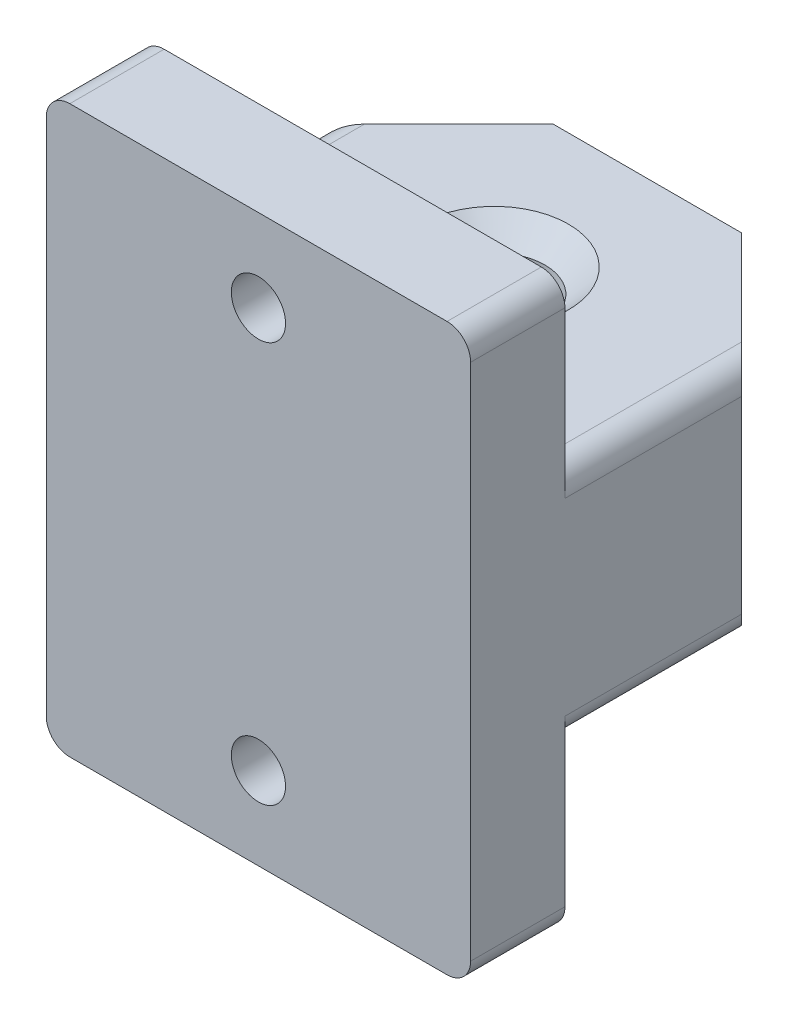
ISO-10303-21;
HEADER;
FILE_DESCRIPTION(('STEP AP214'),'2;1');
FILE_NAME('part.step','',(''),(''),'','','');
FILE_SCHEMA(('AUTOMOTIVE_DESIGN { 1 0 10303 214 1 1 1 1 }'));
ENDSEC;
DATA;
#1=APPLICATION_CONTEXT('core data for automotive mechanical design processes');
#2=APPLICATION_PROTOCOL_DEFINITION('international standard','automotive_design',2000,#1);
#3=PRODUCT_CONTEXT('',#1,'mechanical');
#4=PRODUCT('Part','Part','',(#3));
#5=PRODUCT_RELATED_PRODUCT_CATEGORY('part','',(#4));
#6=PRODUCT_DEFINITION_FORMATION('','',#4);
#7=PRODUCT_DEFINITION_CONTEXT('part definition',#1,'design');
#8=PRODUCT_DEFINITION('design','',#6,#7);
#9=PRODUCT_DEFINITION_SHAPE('','',#8);
#10=(LENGTH_UNIT() NAMED_UNIT(*) SI_UNIT(.MILLI.,.METRE.));
#11=(NAMED_UNIT(*) PLANE_ANGLE_UNIT() SI_UNIT($,.RADIAN.));
#12=(NAMED_UNIT(*) SI_UNIT($,.STERADIAN.) SOLID_ANGLE_UNIT());
#13=UNCERTAINTY_MEASURE_WITH_UNIT(LENGTH_MEASURE(1.E-05),#10,'distance_accuracy_value','');
#14=(GEOMETRIC_REPRESENTATION_CONTEXT(3) GLOBAL_UNCERTAINTY_ASSIGNED_CONTEXT((#13)) GLOBAL_UNIT_ASSIGNED_CONTEXT((#10,
#11,#12)) REPRESENTATION_CONTEXT('',''));
#15=CARTESIAN_POINT('',(0.,0.,0.));
#16=DIRECTION('',(0.,0.,1.));
#17=DIRECTION('',(1.,0.,0.));
#18=AXIS2_PLACEMENT_3D('',#15,#16,#17);
#19=CARTESIAN_POINT('',(9.,-5.,23.));
#20=DIRECTION('',(-1.,0.,0.));
#21=DIRECTION('',(0.,0.,1.));
#22=AXIS2_PLACEMENT_3D('',#19,#20,#21);
#23=PLANE('',#22);
#24=DIRECTION('',(0.,0.,-1.));
#25=VECTOR('',#24,1.);
#26=CARTESIAN_POINT('',(9.,-4.,23.));
#27=LINE('',#26,#25);
#28=CARTESIAN_POINT('',(9.,-4.,19.));
#29=VERTEX_POINT('',#28);
#30=CARTESIAN_POINT('',(9.,-4.,11.5));
#31=VERTEX_POINT('',#30);
#32=EDGE_CURVE('E192',#29,#31,#27,.T.);
#33=ORIENTED_EDGE('',*,*,#32,.T.);
#34=DIRECTION('',(0.,1.,0.));
#35=VECTOR('',#34,1.);
#36=CARTESIAN_POINT('',(9.,-5.,11.5));
#37=LINE('',#36,#35);
#38=CARTESIAN_POINT('',(9.,4.,11.5));
#39=VERTEX_POINT('',#38);
#40=EDGE_CURVE('E452',#31,#39,#37,.T.);
#41=ORIENTED_EDGE('',*,*,#40,.T.);
#42=DIRECTION('',(0.,0.,-1.));
#43=VECTOR('',#42,1.);
#44=CARTESIAN_POINT('',(9.,4.,23.));
#45=LINE('',#44,#43);
#46=CARTESIAN_POINT('',(9.,4.,19.));
#47=VERTEX_POINT('',#46);
#48=EDGE_CURVE('E190',#39,#47,#45,.F.);
#49=ORIENTED_EDGE('',*,*,#48,.T.);
#50=DIRECTION('',(0.,1.,0.));
#51=VECTOR('',#50,1.);
#52=CARTESIAN_POINT('',(9.,0.,19.));
#53=LINE('',#52,#51);
#54=CARTESIAN_POINT('',(9.,11.,19.));
#55=VERTEX_POINT('',#54);
#56=EDGE_CURVE('E377',#47,#55,#53,.T.);
#57=ORIENTED_EDGE('',*,*,#56,.T.);
#58=DIRECTION('',(0.,0.,1.));
#59=VECTOR('',#58,1.);
#60=CARTESIAN_POINT('',(9.,11.,23.));
#61=LINE('',#60,#59);
#62=CARTESIAN_POINT('',(9.,11.,23.));
#63=VERTEX_POINT('',#62);
#64=EDGE_CURVE('E211',#55,#63,#61,.T.);
#65=ORIENTED_EDGE('',*,*,#64,.T.);
#66=DIRECTION('',(0.,1.,0.));
#67=VECTOR('',#66,1.);
#68=CARTESIAN_POINT('',(9.,-5.,23.));
#69=LINE('',#68,#67);
#70=CARTESIAN_POINT('',(9.,-11.,23.));
#71=VERTEX_POINT('',#70);
#72=EDGE_CURVE('E179',#71,#63,#69,.T.);
#73=ORIENTED_EDGE('',*,*,#72,.F.);
#74=DIRECTION('',(0.,0.,1.));
#75=VECTOR('',#74,1.);
#76=CARTESIAN_POINT('',(9.,-11.,23.));
#77=LINE('',#76,#75);
#78=CARTESIAN_POINT('',(9.,-11.,19.));
#79=VERTEX_POINT('',#78);
#80=EDGE_CURVE('E258',#71,#79,#77,.F.);
#81=ORIENTED_EDGE('',*,*,#80,.T.);
#82=DIRECTION('',(0.,-1.,0.));
#83=VECTOR('',#82,1.);
#84=CARTESIAN_POINT('',(9.,0.,19.));
#85=LINE('',#84,#83);
#86=EDGE_CURVE('E352',#29,#79,#85,.T.);
#87=ORIENTED_EDGE('',*,*,#86,.F.);
#88=EDGE_LOOP('',(#33,#41,#49,#57,#65,#73,#81,#87));
#89=FACE_BOUND('',#88,.T.);
#90=ADVANCED_FACE('F34',(#89),#23,.F.);
#91=CARTESIAN_POINT('',(-9.,5.,23.));
#92=DIRECTION('',(0.,-1.,0.));
#93=DIRECTION('',(0.,0.,-1.));
#94=AXIS2_PLACEMENT_3D('',#91,#92,#93);
#95=PLANE('',#94);
#96=CARTESIAN_POINT('',(0.,5.,13.));
#97=DIRECTION('',(0.,-1.,0.));
#98=DIRECTION('',(0.,0.,-1.));
#99=AXIS2_PLACEMENT_3D('',#96,#97,#98);
#100=CIRCLE('',#99,3.15000000000001);
#101=CARTESIAN_POINT('',(0.,5.,9.84999999999999));
#102=VERTEX_POINT('',#101);
#103=EDGE_CURVE('E238',#102,#102,#100,.T.);
#104=ORIENTED_EDGE('',*,*,#103,.T.);
#105=EDGE_LOOP('',(#104));
#106=FACE_BOUND('',#105,.T.);
#107=DIRECTION('',(1.,0.,0.));
#108=VECTOR('',#107,1.);
#109=CARTESIAN_POINT('',(-9.,5.,6.5));
#110=LINE('',#109,#108);
#111=CARTESIAN_POINT('',(-4.,5.,6.5));
#112=VERTEX_POINT('',#111);
#113=CARTESIAN_POINT('',(4.,5.,6.5));
#114=VERTEX_POINT('',#113);
#115=EDGE_CURVE('E180',#112,#114,#110,.T.);
#116=ORIENTED_EDGE('',*,*,#115,.F.);
#117=DIRECTION('',(0.707106781186548,0.,-0.707106781186548));
#118=VECTOR('',#117,1.);
#119=CARTESIAN_POINT('',(-9.,5.,11.5));
#120=LINE('',#119,#118);
#121=CARTESIAN_POINT('',(-8.,5.,10.5));
#122=VERTEX_POINT('',#121);
#123=EDGE_CURVE('E49',#122,#112,#120,.T.);
#124=ORIENTED_EDGE('',*,*,#123,.F.);
#125=DIRECTION('',(0.,0.,-1.));
#126=VECTOR('',#125,1.);
#127=CARTESIAN_POINT('',(-8.,5.,23.));
#128=LINE('',#127,#126);
#129=CARTESIAN_POINT('',(-8.,5.,19.));
#130=VERTEX_POINT('',#129);
#131=EDGE_CURVE('E198',#122,#130,#128,.F.);
#132=ORIENTED_EDGE('',*,*,#131,.T.);
#133=DIRECTION('',(1.,0.,0.));
#134=VECTOR('',#133,1.);
#135=CARTESIAN_POINT('',(-9.,5.,19.));
#136=LINE('',#135,#134);
#137=CARTESIAN_POINT('',(7.99999999999999,5.,19.));
#138=VERTEX_POINT('',#137);
#139=EDGE_CURVE('E383',#130,#138,#136,.T.);
#140=ORIENTED_EDGE('',*,*,#139,.T.);
#141=DIRECTION('',(0.,0.,-1.));
#142=VECTOR('',#141,1.);
#143=CARTESIAN_POINT('',(8.,5.,23.));
#144=LINE('',#143,#142);
#145=CARTESIAN_POINT('',(8.,5.,10.5));
#146=VERTEX_POINT('',#145);
#147=EDGE_CURVE('E200',#138,#146,#144,.T.);
#148=ORIENTED_EDGE('',*,*,#147,.T.);
#149=DIRECTION('',(0.707106781186548,0.,0.707106781186548));
#150=VECTOR('',#149,1.);
#151=CARTESIAN_POINT('',(9.,5.,11.5));
#152=LINE('',#151,#150);
#153=EDGE_CURVE('E457',#114,#146,#152,.T.);
#154=ORIENTED_EDGE('',*,*,#153,.F.);
#155=EDGE_LOOP('',(#116,#124,#132,#140,#148,#154));
#156=FACE_BOUND('',#155,.T.);
#157=ADVANCED_FACE('F285',(#106,#156),#95,.F.);
#158=CARTESIAN_POINT('',(-9.,-5.,23.));
#159=DIRECTION('',(1.,0.,0.));
#160=DIRECTION('',(0.,0.,-1.));
#161=AXIS2_PLACEMENT_3D('',#158,#159,#160);
#162=PLANE('',#161);
#163=DIRECTION('',(0.,0.,-1.));
#164=VECTOR('',#163,1.);
#165=CARTESIAN_POINT('',(-9.,4.,23.));
#166=LINE('',#165,#164);
#167=CARTESIAN_POINT('',(-9.,4.,19.));
#168=VERTEX_POINT('',#167);
#169=CARTESIAN_POINT('',(-9.,4.,11.5));
#170=VERTEX_POINT('',#169);
#171=EDGE_CURVE('E205',#168,#170,#166,.T.);
#172=ORIENTED_EDGE('',*,*,#171,.T.);
#173=DIRECTION('',(0.,1.,0.));
#174=VECTOR('',#173,1.);
#175=CARTESIAN_POINT('',(-9.,-5.,11.5));
#176=LINE('',#175,#174);
#177=CARTESIAN_POINT('',(-9.,-4.,11.5));
#178=VERTEX_POINT('',#177);
#179=EDGE_CURVE('E166',#178,#170,#176,.T.);
#180=ORIENTED_EDGE('',*,*,#179,.F.);
#181=DIRECTION('',(0.,0.,-1.));
#182=VECTOR('',#181,1.);
#183=CARTESIAN_POINT('',(-9.,-4.,23.));
#184=LINE('',#183,#182);
#185=CARTESIAN_POINT('',(-9.,-4.,19.));
#186=VERTEX_POINT('',#185);
#187=EDGE_CURVE('E203',#178,#186,#184,.F.);
#188=ORIENTED_EDGE('',*,*,#187,.T.);
#189=DIRECTION('',(0.,1.,0.));
#190=VECTOR('',#189,1.);
#191=CARTESIAN_POINT('',(-9.,0.,19.));
#192=LINE('',#191,#190);
#193=CARTESIAN_POINT('',(-9.,-11.,19.));
#194=VERTEX_POINT('',#193);
#195=EDGE_CURVE('E357',#194,#186,#192,.T.);
#196=ORIENTED_EDGE('',*,*,#195,.F.);
#197=DIRECTION('',(0.,0.,1.));
#198=VECTOR('',#197,1.);
#199=CARTESIAN_POINT('',(-9.,-11.,23.));
#200=LINE('',#199,#198);
#201=CARTESIAN_POINT('',(-9.,-11.,23.));
#202=VERTEX_POINT('',#201);
#203=EDGE_CURVE('E264',#194,#202,#200,.T.);
#204=ORIENTED_EDGE('',*,*,#203,.T.);
#205=DIRECTION('',(0.,-1.,0.));
#206=VECTOR('',#205,1.);
#207=CARTESIAN_POINT('',(-9.,-5.,23.));
#208=LINE('',#207,#206);
#209=CARTESIAN_POINT('',(-9.,11.,23.));
#210=VERTEX_POINT('',#209);
#211=EDGE_CURVE('E182',#210,#202,#208,.T.);
#212=ORIENTED_EDGE('',*,*,#211,.F.);
#213=DIRECTION('',(0.,0.,1.));
#214=VECTOR('',#213,1.);
#215=CARTESIAN_POINT('',(-9.,11.,19.));
#216=LINE('',#215,#214);
#217=CARTESIAN_POINT('',(-9.,11.,19.));
#218=VERTEX_POINT('',#217);
#219=EDGE_CURVE('E227',#210,#218,#216,.F.);
#220=ORIENTED_EDGE('',*,*,#219,.T.);
#221=DIRECTION('',(0.,-1.,0.));
#222=VECTOR('',#221,1.);
#223=CARTESIAN_POINT('',(-9.,0.,19.));
#224=LINE('',#223,#222);
#225=EDGE_CURVE('E375',#218,#168,#224,.T.);
#226=ORIENTED_EDGE('',*,*,#225,.T.);
#227=EDGE_LOOP('',(#172,#180,#188,#196,#204,#212,#220,#226));
#228=FACE_BOUND('',#227,.T.);
#229=ADVANCED_FACE('F291',(#228),#162,.F.);
#230=CARTESIAN_POINT('',(-9.,-5.,23.));
#231=DIRECTION('',(0.,1.,0.));
#232=DIRECTION('',(0.,0.,1.));
#233=AXIS2_PLACEMENT_3D('',#230,#231,#232);
#234=PLANE('',#233);
#235=CARTESIAN_POINT('',(0.,-5.,13.));
#236=DIRECTION('',(0.,1.,0.));
#237=DIRECTION('',(0.,0.,1.));
#238=AXIS2_PLACEMENT_3D('',#235,#236,#237);
#239=CIRCLE('',#238,3.15);
#240=CARTESIAN_POINT('',(0.,-5.,16.15));
#241=VERTEX_POINT('',#240);
#242=EDGE_CURVE('E229',#241,#241,#239,.T.);
#243=ORIENTED_EDGE('',*,*,#242,.T.);
#244=EDGE_LOOP('',(#243));
#245=FACE_BOUND('',#244,.T.);
#246=DIRECTION('',(0.,0.,-1.));
#247=VECTOR('',#246,1.);
#248=CARTESIAN_POINT('',(-8.,-5.,23.));
#249=LINE('',#248,#247);
#250=CARTESIAN_POINT('',(-8.,-5.,19.));
#251=VERTEX_POINT('',#250);
#252=CARTESIAN_POINT('',(-8.,-5.,10.5));
#253=VERTEX_POINT('',#252);
#254=EDGE_CURVE('E175',#251,#253,#249,.T.);
#255=ORIENTED_EDGE('',*,*,#254,.T.);
#256=DIRECTION('',(0.707106781186548,0.,-0.707106781186548));
#257=VECTOR('',#256,1.);
#258=CARTESIAN_POINT('',(-9.,-5.,11.5));
#259=LINE('',#258,#257);
#260=CARTESIAN_POINT('',(-4.,-5.,6.5));
#261=VERTEX_POINT('',#260);
#262=EDGE_CURVE('E159',#253,#261,#259,.T.);
#263=ORIENTED_EDGE('',*,*,#262,.T.);
#264=DIRECTION('',(1.,0.,0.));
#265=VECTOR('',#264,1.);
#266=CARTESIAN_POINT('',(-9.,-5.,6.5));
#267=LINE('',#266,#265);
#268=CARTESIAN_POINT('',(4.,-5.,6.5));
#269=VERTEX_POINT('',#268);
#270=EDGE_CURVE('E172',#261,#269,#267,.T.);
#271=ORIENTED_EDGE('',*,*,#270,.T.);
#272=DIRECTION('',(0.707106781186548,0.,0.707106781186548));
#273=VECTOR('',#272,1.);
#274=CARTESIAN_POINT('',(9.,-5.,11.5));
#275=LINE('',#274,#273);
#276=CARTESIAN_POINT('',(8.,-5.,10.5));
#277=VERTEX_POINT('',#276);
#278=EDGE_CURVE('E57',#269,#277,#275,.T.);
#279=ORIENTED_EDGE('',*,*,#278,.T.);
#280=DIRECTION('',(0.,0.,-1.));
#281=VECTOR('',#280,1.);
#282=CARTESIAN_POINT('',(8.,-5.,23.));
#283=LINE('',#282,#281);
#284=CARTESIAN_POINT('',(7.99999999999999,-5.,19.));
#285=VERTEX_POINT('',#284);
#286=EDGE_CURVE('E196',#277,#285,#283,.F.);
#287=ORIENTED_EDGE('',*,*,#286,.T.);
#288=DIRECTION('',(-1.,0.,0.));
#289=VECTOR('',#288,1.);
#290=CARTESIAN_POINT('',(-9.,-5.,19.));
#291=LINE('',#290,#289);
#292=EDGE_CURVE('E359',#285,#251,#291,.T.);
#293=ORIENTED_EDGE('',*,*,#292,.T.);
#294=EDGE_LOOP('',(#255,#263,#271,#279,#287,#293));
#295=FACE_BOUND('',#294,.T.);
#296=ADVANCED_FACE('F171',(#245,#295),#234,.F.);
#297=CARTESIAN_POINT('',(0.,0.,23.));
#298=DIRECTION('',(0.,0.,-1.));
#299=DIRECTION('',(-1.,0.,0.));
#300=AXIS2_PLACEMENT_3D('',#297,#298,#299);
#301=PLANE('',#300);
#302=CARTESIAN_POINT('',(0.,-8.5,23.));
#303=DIRECTION('',(0.,0.,1.));
#304=DIRECTION('',(-1.,0.,0.));
#305=AXIS2_PLACEMENT_3D('',#302,#303,#304);
#306=CIRCLE('',#305,1.15);
#307=CARTESIAN_POINT('',(-1.15,-8.5,23.));
#308=VERTEX_POINT('',#307);
#309=EDGE_CURVE('E367',#308,#308,#306,.T.);
#310=ORIENTED_EDGE('',*,*,#309,.F.);
#311=EDGE_LOOP('',(#310));
#312=FACE_BOUND('',#311,.T.);
#313=DIRECTION('',(-1.,0.,0.));
#314=VECTOR('',#313,1.);
#315=CARTESIAN_POINT('',(-9.,-12.,23.));
#316=LINE('',#315,#314);
#317=CARTESIAN_POINT('',(8.,-12.,23.));
#318=VERTEX_POINT('',#317);
#319=CARTESIAN_POINT('',(-8.,-12.,23.));
#320=VERTEX_POINT('',#319);
#321=EDGE_CURVE('E362',#318,#320,#316,.T.);
#322=ORIENTED_EDGE('',*,*,#321,.F.);
#323=CARTESIAN_POINT('',(8.,-11.,23.));
#324=DIRECTION('',(0.,0.,-1.));
#325=DIRECTION('',(-1.,0.,0.));
#326=AXIS2_PLACEMENT_3D('',#323,#324,#325);
#327=CIRCLE('',#326,1.);
#328=EDGE_CURVE('E256',#318,#71,#327,.F.);
#329=ORIENTED_EDGE('',*,*,#328,.T.);
#330=ORIENTED_EDGE('',*,*,#72,.T.);
#331=CARTESIAN_POINT('',(8.,11.,23.));
#332=DIRECTION('',(0.,0.,-1.));
#333=DIRECTION('',(-1.,0.,0.));
#334=AXIS2_PLACEMENT_3D('',#331,#332,#333);
#335=CIRCLE('',#334,1.);
#336=CARTESIAN_POINT('',(8.,12.,23.));
#337=VERTEX_POINT('',#336);
#338=EDGE_CURVE('E216',#63,#337,#335,.F.);
#339=ORIENTED_EDGE('',*,*,#338,.T.);
#340=DIRECTION('',(-1.,0.,0.));
#341=VECTOR('',#340,1.);
#342=CARTESIAN_POINT('',(-9.,12.,23.));
#343=LINE('',#342,#341);
#344=CARTESIAN_POINT('',(-8.,12.,23.));
#345=VERTEX_POINT('',#344);
#346=EDGE_CURVE('E374',#337,#345,#343,.T.);
#347=ORIENTED_EDGE('',*,*,#346,.T.);
#348=CARTESIAN_POINT('',(-8.,11.,23.));
#349=DIRECTION('',(0.,0.,-1.));
#350=DIRECTION('',(-1.,0.,0.));
#351=AXIS2_PLACEMENT_3D('',#348,#349,#350);
#352=CIRCLE('',#351,1.);
#353=EDGE_CURVE('E214',#345,#210,#352,.F.);
#354=ORIENTED_EDGE('',*,*,#353,.T.);
#355=ORIENTED_EDGE('',*,*,#211,.T.);
#356=CARTESIAN_POINT('',(-8.,-11.,23.));
#357=DIRECTION('',(0.,0.,-1.));
#358=DIRECTION('',(-1.,0.,0.));
#359=AXIS2_PLACEMENT_3D('',#356,#357,#358);
#360=CIRCLE('',#359,1.);
#361=EDGE_CURVE('E254',#202,#320,#360,.F.);
#362=ORIENTED_EDGE('',*,*,#361,.T.);
#363=EDGE_LOOP('',(#322,#329,#330,#339,#347,#354,#355,#362));
#364=FACE_BOUND('',#363,.T.);
#365=CARTESIAN_POINT('',(0.,8.5,23.));
#366=DIRECTION('',(0.,0.,-1.));
#367=DIRECTION('',(-1.,0.,0.));
#368=AXIS2_PLACEMENT_3D('',#365,#366,#367);
#369=CIRCLE('',#368,1.15);
#370=CARTESIAN_POINT('',(-1.15,8.5,23.));
#371=VERTEX_POINT('',#370);
#372=EDGE_CURVE('E371',#371,#371,#369,.T.);
#373=ORIENTED_EDGE('',*,*,#372,.T.);
#374=EDGE_LOOP('',(#373));
#375=FACE_BOUND('',#374,.T.);
#376=ADVANCED_FACE('F414',(#312,#364,#375),#301,.F.);
#377=CARTESIAN_POINT('',(0.,-18.,13.));
#378=DIRECTION('',(0.,1.,0.));
#379=DIRECTION('',(0.,0.,1.));
#380=AXIS2_PLACEMENT_3D('',#377,#378,#379);
#381=CYLINDRICAL_SURFACE('',#380,2.15);
#382=CARTESIAN_POINT('',(0.,-4.,13.));
#383=DIRECTION('',(0.,1.,0.));
#384=DIRECTION('',(0.,0.,1.));
#385=AXIS2_PLACEMENT_3D('',#382,#383,#384);
#386=CIRCLE('',#385,2.15);
#387=CARTESIAN_POINT('',(0.,-4.,15.15));
#388=VERTEX_POINT('',#387);
#389=EDGE_CURVE('E235',#388,#388,#386,.F.);
#390=ORIENTED_EDGE('',*,*,#389,.T.);
#391=EDGE_LOOP('',(#390));
#392=FACE_BOUND('',#391,.T.);
#393=CARTESIAN_POINT('',(0.,4.,13.));
#394=DIRECTION('',(0.,-1.,0.));
#395=DIRECTION('',(0.,0.,-1.));
#396=AXIS2_PLACEMENT_3D('',#393,#394,#395);
#397=CIRCLE('',#396,2.15);
#398=CARTESIAN_POINT('',(0.,4.,10.85));
#399=VERTEX_POINT('',#398);
#400=EDGE_CURVE('E232',#399,#399,#397,.F.);
#401=ORIENTED_EDGE('',*,*,#400,.T.);
#402=EDGE_LOOP('',(#401));
#403=FACE_BOUND('',#402,.T.);
#404=ADVANCED_FACE('F300',(#392,#403),#381,.F.);
#405=CARTESIAN_POINT('',(8.,-4.,23.));
#406=DIRECTION('',(0.,0.,-1.));
#407=DIRECTION('',(-1.,0.,0.));
#408=AXIS2_PLACEMENT_3D('',#405,#406,#407);
#409=CYLINDRICAL_SURFACE('',#408,1.);
#410=CARTESIAN_POINT('',(8.,-4.,10.5));
#411=DIRECTION('',(-0.707106781186548,0.,0.707106781186548));
#412=DIRECTION('',(-0.707106781186548,0.,-0.707106781186548));
#413=AXIS2_PLACEMENT_3D('',#410,#411,#412);
#414=ELLIPSE('',#413,1.41421356237309,1.);
#415=EDGE_CURVE('E401',#31,#277,#414,.F.);
#416=ORIENTED_EDGE('',*,*,#415,.F.);
#417=ORIENTED_EDGE('',*,*,#32,.F.);
#418=CARTESIAN_POINT('',(8.,-4.,19.));
#419=DIRECTION('',(0.,0.,-1.));
#420=DIRECTION('',(-1.,0.,0.));
#421=AXIS2_PLACEMENT_3D('',#418,#419,#420);
#422=CIRCLE('',#421,1.);
#423=EDGE_CURVE('E369',#285,#29,#422,.F.);
#424=ORIENTED_EDGE('',*,*,#423,.F.);
#425=ORIENTED_EDGE('',*,*,#286,.F.);
#426=EDGE_LOOP('',(#416,#417,#424,#425));
#427=FACE_BOUND('',#426,.T.);
#428=ADVANCED_FACE('F296',(#427),#409,.T.);
#429=CARTESIAN_POINT('',(8.,4.,23.));
#430=DIRECTION('',(0.,0.,-1.));
#431=DIRECTION('',(-1.,0.,0.));
#432=AXIS2_PLACEMENT_3D('',#429,#430,#431);
#433=CYLINDRICAL_SURFACE('',#432,1.);
#434=CARTESIAN_POINT('',(8.,4.,10.5));
#435=DIRECTION('',(-0.707106781186548,0.,0.707106781186548));
#436=DIRECTION('',(-0.707106781186548,0.,-0.707106781186548));
#437=AXIS2_PLACEMENT_3D('',#434,#435,#436);
#438=ELLIPSE('',#437,1.41421356237309,1.);
#439=EDGE_CURVE('E165',#146,#39,#438,.F.);
#440=ORIENTED_EDGE('',*,*,#439,.F.);
#441=ORIENTED_EDGE('',*,*,#147,.F.);
#442=CARTESIAN_POINT('',(8.,4.,19.));
#443=DIRECTION('',(0.,0.,-1.));
#444=DIRECTION('',(-1.,0.,0.));
#445=AXIS2_PLACEMENT_3D('',#442,#443,#444);
#446=CIRCLE('',#445,1.);
#447=EDGE_CURVE('E184',#47,#138,#446,.F.);
#448=ORIENTED_EDGE('',*,*,#447,.F.);
#449=ORIENTED_EDGE('',*,*,#48,.F.);
#450=EDGE_LOOP('',(#440,#441,#448,#449));
#451=FACE_BOUND('',#450,.T.);
#452=ADVANCED_FACE('F299',(#451),#433,.T.);
#453=CARTESIAN_POINT('',(-8.,4.,23.));
#454=DIRECTION('',(0.,0.,-1.));
#455=DIRECTION('',(-1.,0.,0.));
#456=AXIS2_PLACEMENT_3D('',#453,#454,#455);
#457=CYLINDRICAL_SURFACE('',#456,1.);
#458=CARTESIAN_POINT('',(-8.,4.,10.5));
#459=DIRECTION('',(0.707106781186548,0.,0.707106781186548));
#460=DIRECTION('',(0.707106781186548,0.,-0.707106781186548));
#461=AXIS2_PLACEMENT_3D('',#458,#459,#460);
#462=ELLIPSE('',#461,1.41421356237309,1.);
#463=EDGE_CURVE('E409',#170,#122,#462,.F.);
#464=ORIENTED_EDGE('',*,*,#463,.F.);
#465=ORIENTED_EDGE('',*,*,#171,.F.);
#466=CARTESIAN_POINT('',(-8.,4.,19.));
#467=DIRECTION('',(0.,0.,-1.));
#468=DIRECTION('',(-1.,0.,0.));
#469=AXIS2_PLACEMENT_3D('',#466,#467,#468);
#470=CIRCLE('',#469,1.);
#471=EDGE_CURVE('E208',#130,#168,#470,.F.);
#472=ORIENTED_EDGE('',*,*,#471,.F.);
#473=ORIENTED_EDGE('',*,*,#131,.F.);
#474=EDGE_LOOP('',(#464,#465,#472,#473));
#475=FACE_BOUND('',#474,.T.);
#476=ADVANCED_FACE('F304',(#475),#457,.T.);
#477=CARTESIAN_POINT('',(-8.,-4.,23.));
#478=DIRECTION('',(0.,0.,-1.));
#479=DIRECTION('',(-1.,0.,0.));
#480=AXIS2_PLACEMENT_3D('',#477,#478,#479);
#481=CYLINDRICAL_SURFACE('',#480,1.);
#482=CARTESIAN_POINT('',(-8.,-4.,10.5));
#483=DIRECTION('',(0.707106781186548,0.,0.707106781186548));
#484=DIRECTION('',(0.707106781186548,0.,-0.707106781186548));
#485=AXIS2_PLACEMENT_3D('',#482,#483,#484);
#486=ELLIPSE('',#485,1.41421356237309,1.);
#487=EDGE_CURVE('E403',#253,#178,#486,.F.);
#488=ORIENTED_EDGE('',*,*,#487,.F.);
#489=ORIENTED_EDGE('',*,*,#254,.F.);
#490=CARTESIAN_POINT('',(-8.,-4.,19.));
#491=DIRECTION('',(0.,0.,-1.));
#492=DIRECTION('',(-1.,0.,0.));
#493=AXIS2_PLACEMENT_3D('',#490,#491,#492);
#494=CIRCLE('',#493,1.);
#495=EDGE_CURVE('E247',#186,#251,#494,.F.);
#496=ORIENTED_EDGE('',*,*,#495,.F.);
#497=ORIENTED_EDGE('',*,*,#187,.F.);
#498=EDGE_LOOP('',(#488,#489,#496,#497));
#499=FACE_BOUND('',#498,.T.);
#500=ADVANCED_FACE('F308',(#499),#481,.T.);
#501=CARTESIAN_POINT('',(-9.,-18.,6.5));
#502=DIRECTION('',(0.,0.,1.));
#503=DIRECTION('',(1.,0.,0.));
#504=AXIS2_PLACEMENT_3D('',#501,#502,#503);
#505=PLANE('',#504);
#506=ORIENTED_EDGE('',*,*,#270,.F.);
#507=DIRECTION('',(0.,1.,0.));
#508=VECTOR('',#507,1.);
#509=CARTESIAN_POINT('',(-4.,-5.,6.5));
#510=LINE('',#509,#508);
#511=EDGE_CURVE('E156',#261,#112,#510,.T.);
#512=ORIENTED_EDGE('',*,*,#511,.T.);
#513=ORIENTED_EDGE('',*,*,#115,.T.);
#514=DIRECTION('',(0.,1.,0.));
#515=VECTOR('',#514,1.);
#516=CARTESIAN_POINT('',(4.,-5.,6.5));
#517=LINE('',#516,#515);
#518=EDGE_CURVE('E178',#269,#114,#517,.T.);
#519=ORIENTED_EDGE('',*,*,#518,.F.);
#520=EDGE_LOOP('',(#506,#512,#513,#519));
#521=FACE_BOUND('',#520,.T.);
#522=ADVANCED_FACE('F177',(#521),#505,.F.);
#523=CARTESIAN_POINT('',(-9.,12.,19.));
#524=DIRECTION('',(0.,1.,0.));
#525=DIRECTION('',(0.,0.,1.));
#526=AXIS2_PLACEMENT_3D('',#523,#524,#525);
#527=PLANE('',#526);
#528=ORIENTED_EDGE('',*,*,#346,.F.);
#529=DIRECTION('',(0.,0.,1.));
#530=VECTOR('',#529,1.);
#531=CARTESIAN_POINT('',(8.,12.,19.));
#532=LINE('',#531,#530);
#533=CARTESIAN_POINT('',(8.,12.,19.));
#534=VERTEX_POINT('',#533);
#535=EDGE_CURVE('E221',#337,#534,#532,.F.);
#536=ORIENTED_EDGE('',*,*,#535,.T.);
#537=DIRECTION('',(-1.,0.,0.));
#538=VECTOR('',#537,1.);
#539=CARTESIAN_POINT('',(-9.,12.,19.));
#540=LINE('',#539,#538);
#541=CARTESIAN_POINT('',(-8.,12.,19.));
#542=VERTEX_POINT('',#541);
#543=EDGE_CURVE('E380',#534,#542,#540,.T.);
#544=ORIENTED_EDGE('',*,*,#543,.T.);
#545=DIRECTION('',(0.,0.,1.));
#546=VECTOR('',#545,1.);
#547=CARTESIAN_POINT('',(-8.,12.,23.));
#548=LINE('',#547,#546);
#549=EDGE_CURVE('E218',#542,#345,#548,.T.);
#550=ORIENTED_EDGE('',*,*,#549,.T.);
#551=EDGE_LOOP('',(#528,#536,#544,#550));
#552=FACE_BOUND('',#551,.T.);
#553=ADVANCED_FACE('F427',(#552),#527,.T.);
#554=CARTESIAN_POINT('',(0.,0.,19.));
#555=DIRECTION('',(0.,0.,-1.));
#556=DIRECTION('',(-1.,0.,0.));
#557=AXIS2_PLACEMENT_3D('',#554,#555,#556);
#558=PLANE('',#557);
#559=CARTESIAN_POINT('',(0.,8.5,19.));
#560=DIRECTION('',(0.,0.,-1.));
#561=DIRECTION('',(-1.,0.,0.));
#562=AXIS2_PLACEMENT_3D('',#559,#560,#561);
#563=CIRCLE('',#562,2.15);
#564=CARTESIAN_POINT('',(-2.15,8.5,19.));
#565=VERTEX_POINT('',#564);
#566=EDGE_CURVE('E244',#565,#565,#563,.F.);
#567=ORIENTED_EDGE('',*,*,#566,.T.);
#568=EDGE_LOOP('',(#567));
#569=FACE_BOUND('',#568,.T.);
#570=ORIENTED_EDGE('',*,*,#543,.F.);
#571=CARTESIAN_POINT('',(8.,11.,19.));
#572=DIRECTION('',(0.,0.,-1.));
#573=DIRECTION('',(-1.,0.,0.));
#574=AXIS2_PLACEMENT_3D('',#571,#572,#573);
#575=CIRCLE('',#574,1.);
#576=EDGE_CURVE('E225',#534,#55,#575,.T.);
#577=ORIENTED_EDGE('',*,*,#576,.T.);
#578=ORIENTED_EDGE('',*,*,#56,.F.);
#579=ORIENTED_EDGE('',*,*,#447,.T.);
#580=ORIENTED_EDGE('',*,*,#139,.F.);
#581=ORIENTED_EDGE('',*,*,#471,.T.);
#582=ORIENTED_EDGE('',*,*,#225,.F.);
#583=CARTESIAN_POINT('',(-8.,11.,19.));
#584=DIRECTION('',(0.,0.,-1.));
#585=DIRECTION('',(-1.,0.,0.));
#586=AXIS2_PLACEMENT_3D('',#583,#584,#585);
#587=CIRCLE('',#586,1.);
#588=EDGE_CURVE('E223',#218,#542,#587,.T.);
#589=ORIENTED_EDGE('',*,*,#588,.T.);
#590=EDGE_LOOP('',(#570,#577,#578,#579,#580,#581,#582,#589));
#591=FACE_BOUND('',#590,.T.);
#592=ADVANCED_FACE('F392',(#569,#591),#558,.T.);
#593=CARTESIAN_POINT('',(0.,8.5,23.));
#594=DIRECTION('',(0.,0.,-1.));
#595=DIRECTION('',(-1.,0.,0.));
#596=AXIS2_PLACEMENT_3D('',#593,#594,#595);
#597=CYLINDRICAL_SURFACE('',#596,1.15);
#598=CARTESIAN_POINT('',(0.,8.5,20.));
#599=DIRECTION('',(0.,0.,-1.));
#600=DIRECTION('',(-1.,0.,0.));
#601=AXIS2_PLACEMENT_3D('',#598,#599,#600);
#602=CIRCLE('',#601,1.15);
#603=CARTESIAN_POINT('',(-1.15,8.5,20.));
#604=VERTEX_POINT('',#603);
#605=EDGE_CURVE('E241',#604,#604,#602,.T.);
#606=ORIENTED_EDGE('',*,*,#605,.T.);
#607=EDGE_LOOP('',(#606));
#608=FACE_BOUND('',#607,.T.);
#609=ORIENTED_EDGE('',*,*,#372,.F.);
#610=EDGE_LOOP('',(#609));
#611=FACE_BOUND('',#610,.T.);
#612=ADVANCED_FACE('F317',(#608,#611),#597,.F.);
#613=CARTESIAN_POINT('',(8.,11.,23.));
#614=DIRECTION('',(0.,0.,-1.));
#615=DIRECTION('',(-1.,0.,0.));
#616=AXIS2_PLACEMENT_3D('',#613,#614,#615);
#617=CYLINDRICAL_SURFACE('',#616,1.);
#618=ORIENTED_EDGE('',*,*,#576,.F.);
#619=ORIENTED_EDGE('',*,*,#535,.F.);
#620=ORIENTED_EDGE('',*,*,#338,.F.);
#621=ORIENTED_EDGE('',*,*,#64,.F.);
#622=EDGE_LOOP('',(#618,#619,#620,#621));
#623=FACE_BOUND('',#622,.T.);
#624=ADVANCED_FACE('F313',(#623),#617,.T.);
#625=CARTESIAN_POINT('',(-8.,11.,19.));
#626=DIRECTION('',(0.,0.,-1.));
#627=DIRECTION('',(-1.,0.,0.));
#628=AXIS2_PLACEMENT_3D('',#625,#626,#627);
#629=CYLINDRICAL_SURFACE('',#628,1.);
#630=ORIENTED_EDGE('',*,*,#588,.F.);
#631=ORIENTED_EDGE('',*,*,#219,.F.);
#632=ORIENTED_EDGE('',*,*,#353,.F.);
#633=ORIENTED_EDGE('',*,*,#549,.F.);
#634=EDGE_LOOP('',(#630,#631,#632,#633));
#635=FACE_BOUND('',#634,.T.);
#636=ADVANCED_FACE('F316',(#635),#629,.T.);
#637=CARTESIAN_POINT('',(0.,-5.,13.));
#638=DIRECTION('',(0.,-1.,0.));
#639=DIRECTION('',(0.,0.,-1.));
#640=AXIS2_PLACEMENT_3D('',#637,#638,#639);
#641=CONICAL_SURFACE('',#640,3.15,0.785398163397446);
#642=ORIENTED_EDGE('',*,*,#389,.F.);
#643=EDGE_LOOP('',(#642));
#644=FACE_BOUND('',#643,.T.);
#645=ORIENTED_EDGE('',*,*,#242,.F.);
#646=EDGE_LOOP('',(#645));
#647=FACE_BOUND('',#646,.T.);
#648=ADVANCED_FACE('F321',(#644,#647),#641,.F.);
#649=CARTESIAN_POINT('',(0.,4.,13.));
#650=DIRECTION('',(0.,1.,0.));
#651=DIRECTION('',(0.,0.,1.));
#652=AXIS2_PLACEMENT_3D('',#649,#650,#651);
#653=CONICAL_SURFACE('',#652,2.15,0.785398163397449);
#654=ORIENTED_EDGE('',*,*,#103,.F.);
#655=EDGE_LOOP('',(#654));
#656=FACE_BOUND('',#655,.T.);
#657=ORIENTED_EDGE('',*,*,#400,.F.);
#658=EDGE_LOOP('',(#657));
#659=FACE_BOUND('',#658,.T.);
#660=ADVANCED_FACE('F325',(#656,#659),#653,.F.);
#661=CARTESIAN_POINT('',(0.,8.5,20.));
#662=DIRECTION('',(0.,0.,-1.));
#663=DIRECTION('',(-1.,0.,0.));
#664=AXIS2_PLACEMENT_3D('',#661,#662,#663);
#665=CONICAL_SURFACE('',#664,1.15,0.785398163397449);
#666=ORIENTED_EDGE('',*,*,#566,.F.);
#667=EDGE_LOOP('',(#666));
#668=FACE_BOUND('',#667,.T.);
#669=ORIENTED_EDGE('',*,*,#605,.F.);
#670=EDGE_LOOP('',(#669));
#671=FACE_BOUND('',#670,.T.);
#672=ADVANCED_FACE('F329',(#668,#671),#665,.F.);
#673=CARTESIAN_POINT('',(-9.,-12.,19.));
#674=DIRECTION('',(0.,1.,0.));
#675=DIRECTION('',(0.,0.,1.));
#676=AXIS2_PLACEMENT_3D('',#673,#674,#675);
#677=PLANE('',#676);
#678=DIRECTION('',(-1.,0.,0.));
#679=VECTOR('',#678,1.);
#680=CARTESIAN_POINT('',(-9.,-12.,19.));
#681=LINE('',#680,#679);
#682=CARTESIAN_POINT('',(8.,-12.,19.));
#683=VERTEX_POINT('',#682);
#684=CARTESIAN_POINT('',(-8.,-12.,19.));
#685=VERTEX_POINT('',#684);
#686=EDGE_CURVE('E349',#683,#685,#681,.T.);
#687=ORIENTED_EDGE('',*,*,#686,.F.);
#688=DIRECTION('',(0.,0.,1.));
#689=VECTOR('',#688,1.);
#690=CARTESIAN_POINT('',(8.,-12.,19.));
#691=LINE('',#690,#689);
#692=EDGE_CURVE('E251',#683,#318,#691,.T.);
#693=ORIENTED_EDGE('',*,*,#692,.T.);
#694=ORIENTED_EDGE('',*,*,#321,.T.);
#695=DIRECTION('',(0.,0.,1.));
#696=VECTOR('',#695,1.);
#697=CARTESIAN_POINT('',(-8.,-12.,19.));
#698=LINE('',#697,#696);
#699=EDGE_CURVE('E249',#320,#685,#698,.F.);
#700=ORIENTED_EDGE('',*,*,#699,.T.);
#701=EDGE_LOOP('',(#687,#693,#694,#700));
#702=FACE_BOUND('',#701,.T.);
#703=ADVANCED_FACE('F333',(#702),#677,.F.);
#704=CARTESIAN_POINT('',(0.,0.,19.));
#705=DIRECTION('',(0.,0.,-1.));
#706=DIRECTION('',(-1.,0.,0.));
#707=AXIS2_PLACEMENT_3D('',#704,#705,#706);
#708=PLANE('',#707);
#709=CARTESIAN_POINT('',(0.,-8.5,19.));
#710=DIRECTION('',(0.,0.,-1.));
#711=DIRECTION('',(-1.,0.,0.));
#712=AXIS2_PLACEMENT_3D('',#709,#710,#711);
#713=CIRCLE('',#712,1.65);
#714=CARTESIAN_POINT('',(-1.65,-8.5,19.));
#715=VERTEX_POINT('',#714);
#716=EDGE_CURVE('E42',#715,#715,#713,.F.);
#717=ORIENTED_EDGE('',*,*,#716,.T.);
#718=EDGE_LOOP('',(#717));
#719=FACE_BOUND('',#718,.T.);
#720=ORIENTED_EDGE('',*,*,#86,.T.);
#721=CARTESIAN_POINT('',(8.,-11.,19.));
#722=DIRECTION('',(0.,0.,-1.));
#723=DIRECTION('',(-1.,0.,0.));
#724=AXIS2_PLACEMENT_3D('',#721,#722,#723);
#725=CIRCLE('',#724,1.);
#726=EDGE_CURVE('E262',#79,#683,#725,.T.);
#727=ORIENTED_EDGE('',*,*,#726,.T.);
#728=ORIENTED_EDGE('',*,*,#686,.T.);
#729=CARTESIAN_POINT('',(-8.,-11.,19.));
#730=DIRECTION('',(0.,0.,-1.));
#731=DIRECTION('',(-1.,0.,0.));
#732=AXIS2_PLACEMENT_3D('',#729,#730,#731);
#733=CIRCLE('',#732,1.);
#734=EDGE_CURVE('E260',#685,#194,#733,.T.);
#735=ORIENTED_EDGE('',*,*,#734,.T.);
#736=ORIENTED_EDGE('',*,*,#195,.T.);
#737=ORIENTED_EDGE('',*,*,#495,.T.);
#738=ORIENTED_EDGE('',*,*,#292,.F.);
#739=ORIENTED_EDGE('',*,*,#423,.T.);
#740=EDGE_LOOP('',(#720,#727,#728,#735,#736,#737,#738,#739));
#741=FACE_BOUND('',#740,.T.);
#742=ADVANCED_FACE('F269',(#719,#741),#708,.T.);
#743=CARTESIAN_POINT('',(0.,-8.5,23.));
#744=DIRECTION('',(0.,0.,-1.));
#745=DIRECTION('',(-1.,0.,0.));
#746=AXIS2_PLACEMENT_3D('',#743,#744,#745);
#747=CYLINDRICAL_SURFACE('',#746,1.15);
#748=CARTESIAN_POINT('',(0.,-8.5,19.5));
#749=DIRECTION('',(0.,0.,-1.));
#750=DIRECTION('',(-1.,0.,0.));
#751=AXIS2_PLACEMENT_3D('',#748,#749,#750);
#752=CIRCLE('',#751,1.15);
#753=CARTESIAN_POINT('',(-1.15,-8.5,19.5));
#754=VERTEX_POINT('',#753);
#755=EDGE_CURVE('E11',#754,#754,#752,.T.);
#756=ORIENTED_EDGE('',*,*,#755,.T.);
#757=EDGE_LOOP('',(#756));
#758=FACE_BOUND('',#757,.T.);
#759=ORIENTED_EDGE('',*,*,#309,.T.);
#760=EDGE_LOOP('',(#759));
#761=FACE_BOUND('',#760,.T.);
#762=ADVANCED_FACE('F336',(#758,#761),#747,.F.);
#763=CARTESIAN_POINT('',(8.,-11.,19.));
#764=DIRECTION('',(0.,0.,1.));
#765=DIRECTION('',(1.,0.,0.));
#766=AXIS2_PLACEMENT_3D('',#763,#764,#765);
#767=CYLINDRICAL_SURFACE('',#766,1.);
#768=ORIENTED_EDGE('',*,*,#726,.F.);
#769=ORIENTED_EDGE('',*,*,#80,.F.);
#770=ORIENTED_EDGE('',*,*,#328,.F.);
#771=ORIENTED_EDGE('',*,*,#692,.F.);
#772=EDGE_LOOP('',(#768,#769,#770,#771));
#773=FACE_BOUND('',#772,.T.);
#774=ADVANCED_FACE('F281',(#773),#767,.T.);
#775=CARTESIAN_POINT('',(-8.,-11.,23.));
#776=DIRECTION('',(0.,0.,1.));
#777=DIRECTION('',(1.,0.,0.));
#778=AXIS2_PLACEMENT_3D('',#775,#776,#777);
#779=CYLINDRICAL_SURFACE('',#778,1.);
#780=ORIENTED_EDGE('',*,*,#734,.F.);
#781=ORIENTED_EDGE('',*,*,#699,.F.);
#782=ORIENTED_EDGE('',*,*,#361,.F.);
#783=ORIENTED_EDGE('',*,*,#203,.F.);
#784=EDGE_LOOP('',(#780,#781,#782,#783));
#785=FACE_BOUND('',#784,.T.);
#786=ADVANCED_FACE('F274',(#785),#779,.T.);
#787=CARTESIAN_POINT('',(0.,-8.5,19.));
#788=DIRECTION('',(0.,0.,-1.));
#789=DIRECTION('',(-1.,0.,0.));
#790=AXIS2_PLACEMENT_3D('',#787,#788,#789);
#791=CONICAL_SURFACE('',#790,1.65,0.785398163397444);
#792=ORIENTED_EDGE('',*,*,#755,.F.);
#793=EDGE_LOOP('',(#792));
#794=FACE_BOUND('',#793,.T.);
#795=ORIENTED_EDGE('',*,*,#716,.F.);
#796=EDGE_LOOP('',(#795));
#797=FACE_BOUND('',#796,.T.);
#798=ADVANCED_FACE('F36',(#794,#797),#791,.F.);
#799=CARTESIAN_POINT('',(9.,-5.,11.5));
#800=DIRECTION('',(-0.707106781186548,0.,0.707106781186548));
#801=DIRECTION('',(0.707106781186548,0.,0.707106781186548));
#802=AXIS2_PLACEMENT_3D('',#799,#800,#801);
#803=PLANE('',#802);
#804=ORIENTED_EDGE('',*,*,#415,.T.);
#805=ORIENTED_EDGE('',*,*,#278,.F.);
#806=ORIENTED_EDGE('',*,*,#518,.T.);
#807=ORIENTED_EDGE('',*,*,#153,.T.);
#808=ORIENTED_EDGE('',*,*,#439,.T.);
#809=ORIENTED_EDGE('',*,*,#40,.F.);
#810=EDGE_LOOP('',(#804,#805,#806,#807,#808,#809));
#811=FACE_BOUND('',#810,.T.);
#812=ADVANCED_FACE('F273',(#811),#803,.F.);
#813=CARTESIAN_POINT('',(-9.,-5.,11.5));
#814=DIRECTION('',(0.707106781186548,0.,0.707106781186548));
#815=DIRECTION('',(0.707106781186548,0.,-0.707106781186548));
#816=AXIS2_PLACEMENT_3D('',#813,#814,#815);
#817=PLANE('',#816);
#818=ORIENTED_EDGE('',*,*,#463,.T.);
#819=ORIENTED_EDGE('',*,*,#123,.T.);
#820=ORIENTED_EDGE('',*,*,#511,.F.);
#821=ORIENTED_EDGE('',*,*,#262,.F.);
#822=ORIENTED_EDGE('',*,*,#487,.T.);
#823=ORIENTED_EDGE('',*,*,#179,.T.);
#824=EDGE_LOOP('',(#818,#819,#820,#821,#822,#823));
#825=FACE_BOUND('',#824,.T.);
#826=ADVANCED_FACE('F158',(#825),#817,.F.);
#827=CLOSED_SHELL('',(#90,#157,#229,#296,#376,#404,#428,#452,#476,#500,#522,#553,#592,#612,#624,
#636,#648,#660,#672,#703,#742,#762,#774,#786,#798,#812,#826));
#828=MANIFOLD_SOLID_BREP('B2',#827);
#829=ADVANCED_BREP_SHAPE_REPRESENTATION('',(#18,#828),#14);
#830=SHAPE_DEFINITION_REPRESENTATION(#9,#829);
ENDSEC;
END-ISO-10303-21;
